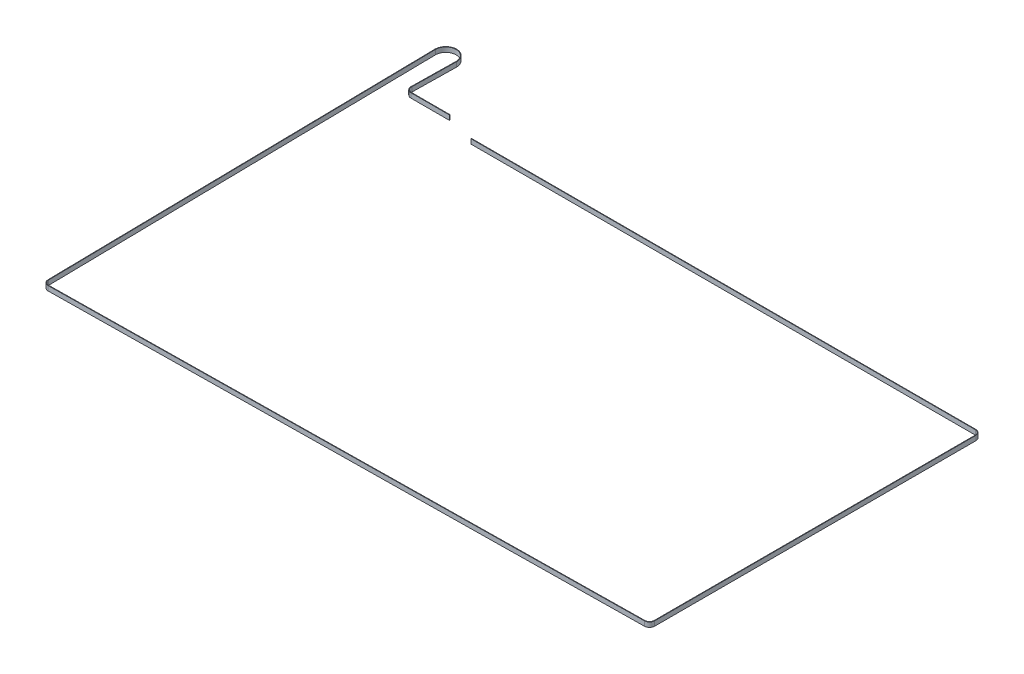
ISO-10303-21;
HEADER;
FILE_DESCRIPTION(('STEP AP214'),'2;1');
FILE_NAME('part.step','',(''),(''),'','','');
FILE_SCHEMA(('AUTOMOTIVE_DESIGN { 1 0 10303 214 1 1 1 1 }'));
ENDSEC;
DATA;
#1=APPLICATION_CONTEXT('core data for automotive mechanical design processes');
#2=APPLICATION_PROTOCOL_DEFINITION('international standard','automotive_design',2000,#1);
#3=PRODUCT_CONTEXT('',#1,'mechanical');
#4=PRODUCT('Part','Part','',(#3));
#5=PRODUCT_RELATED_PRODUCT_CATEGORY('part','',(#4));
#6=PRODUCT_DEFINITION_FORMATION('','',#4);
#7=PRODUCT_DEFINITION_CONTEXT('part definition',#1,'design');
#8=PRODUCT_DEFINITION('design','',#6,#7);
#9=PRODUCT_DEFINITION_SHAPE('','',#8);
#10=(LENGTH_UNIT() NAMED_UNIT(*) SI_UNIT(.MILLI.,.METRE.));
#11=(NAMED_UNIT(*) PLANE_ANGLE_UNIT() SI_UNIT($,.RADIAN.));
#12=(NAMED_UNIT(*) SI_UNIT($,.STERADIAN.) SOLID_ANGLE_UNIT());
#13=UNCERTAINTY_MEASURE_WITH_UNIT(LENGTH_MEASURE(1.E-05),#10,'distance_accuracy_value','');
#14=(GEOMETRIC_REPRESENTATION_CONTEXT(3) GLOBAL_UNCERTAINTY_ASSIGNED_CONTEXT((#13)) GLOBAL_UNIT_ASSIGNED_CONTEXT((#10,
#11,#12)) REPRESENTATION_CONTEXT('',''));
#15=CARTESIAN_POINT('',(0.,0.,0.));
#16=DIRECTION('',(0.,0.,1.));
#17=DIRECTION('',(1.,0.,0.));
#18=AXIS2_PLACEMENT_3D('',#15,#16,#17);
#19=CARTESIAN_POINT('',(107.943827046519,0.,89.0868906889753));
#20=DIRECTION('',(-0.999999924430759,0.,0.00038876532332332));
#21=DIRECTION('',(0.000388765323323324,0.,0.999999924430759));
#22=AXIS2_PLACEMENT_3D('',#19,#20,#21);
#23=PLANE('',#22);
#24=DIRECTION('',(0.,-1.,0.));
#25=VECTOR('',#24,1.);
#26=CARTESIAN_POINT('',(107.938449134375,9.5,75.2535793960742));
#27=LINE('',#26,#25);
#28=CARTESIAN_POINT('',(107.938449134375,15.5,75.2535793960742));
#29=VERTEX_POINT('',#28);
#30=CARTESIAN_POINT('',(107.938449134375,9.5,75.2535793960742));
#31=VERTEX_POINT('',#30);
#32=EDGE_CURVE('E220',#29,#31,#27,.T.);
#33=ORIENTED_EDGE('',*,*,#32,.T.);
#34=DIRECTION('',(0.000388765323323324,0.,0.999999924430759));
#35=VECTOR('',#34,1.);
#36=CARTESIAN_POINT('',(107.938709607142,9.5,75.9235793454429));
#37=LINE('',#36,#35);
#38=CARTESIAN_POINT('',(107.938709607142,9.5,75.9235793454429));
#39=VERTEX_POINT('',#38);
#40=EDGE_CURVE('E219',#31,#39,#37,.T.);
#41=ORIENTED_EDGE('',*,*,#40,.T.);
#42=DIRECTION('',(0.,1.,0.));
#43=VECTOR('',#42,1.);
#44=CARTESIAN_POINT('',(107.938709607142,9.5,75.9235793454429));
#45=LINE('',#44,#43);
#46=CARTESIAN_POINT('',(107.938709607142,15.5,75.9235793454429));
#47=VERTEX_POINT('',#46);
#48=EDGE_CURVE('E194',#39,#47,#45,.T.);
#49=ORIENTED_EDGE('',*,*,#48,.T.);
#50=DIRECTION('',(-0.000388765323323324,0.,-0.999999924430759));
#51=VECTOR('',#50,1.);
#52=CARTESIAN_POINT('',(107.938709607142,15.5,75.9235793454429));
#53=LINE('',#52,#51);
#54=EDGE_CURVE('E231',#47,#29,#53,.T.);
#55=ORIENTED_EDGE('',*,*,#54,.T.);
#56=EDGE_LOOP('',(#33,#41,#49,#55));
#57=FACE_BOUND('',#56,.T.);
#58=ADVANCED_FACE('F39',(#57),#23,.T.);
#59=CARTESIAN_POINT('',(67.9385793707588,0.,76.5868917090327));
#60=DIRECTION('',(-1.,0.,0.));
#61=DIRECTION('',(0.,0.,1.));
#62=AXIS2_PLACEMENT_3D('',#59,#60,#61);
#63=PLANE('',#62);
#64=DIRECTION('',(0.,-1.,0.));
#65=VECTOR('',#64,1.);
#66=CARTESIAN_POINT('',(67.9385793707588,9.5,62.7535793707587));
#67=LINE('',#66,#65);
#68=CARTESIAN_POINT('',(67.9385793707588,15.5,62.7535793707587));
#69=VERTEX_POINT('',#68);
#70=CARTESIAN_POINT('',(67.9385793707588,9.5,62.7535793707587));
#71=VERTEX_POINT('',#70);
#72=EDGE_CURVE('E1397',#69,#71,#67,.T.);
#73=ORIENTED_EDGE('',*,*,#72,.F.);
#74=DIRECTION('',(0.,0.,-1.));
#75=VECTOR('',#74,1.);
#76=CARTESIAN_POINT('',(67.9385793707588,15.5,63.4235793707587));
#77=LINE('',#76,#75);
#78=CARTESIAN_POINT('',(67.9385793707588,15.5,63.4235793707587));
#79=VERTEX_POINT('',#78);
#80=EDGE_CURVE('E1401',#79,#69,#77,.T.);
#81=ORIENTED_EDGE('',*,*,#80,.F.);
#82=DIRECTION('',(0.,1.,0.));
#83=VECTOR('',#82,1.);
#84=CARTESIAN_POINT('',(67.9385793707588,9.5,63.4235793707587));
#85=LINE('',#84,#83);
#86=CARTESIAN_POINT('',(67.9385793707588,9.5,63.4235793707587));
#87=VERTEX_POINT('',#86);
#88=EDGE_CURVE('E1419',#87,#79,#85,.T.);
#89=ORIENTED_EDGE('',*,*,#88,.F.);
#90=DIRECTION('',(0.,0.,1.));
#91=VECTOR('',#90,1.);
#92=CARTESIAN_POINT('',(67.9385793707588,9.5,63.4235793707587));
#93=LINE('',#92,#91);
#94=EDGE_CURVE('E1405',#71,#87,#93,.T.);
#95=ORIENTED_EDGE('',*,*,#94,.F.);
#96=EDGE_LOOP('',(#73,#81,#89,#95));
#97=FACE_BOUND('',#96,.T.);
#98=ADVANCED_FACE('F280',(#97),#63,.F.);
#99=CARTESIAN_POINT('',(751.000130236383,9.5,75.6735793454429));
#100=DIRECTION('',(0.000388765323323291,0.,0.999999924430759));
#101=DIRECTION('',(0.999999924430759,0.,-0.000388765323323292));
#102=AXIS2_PLACEMENT_3D('',#99,#100,#101);
#103=PLANE('',#102);
#104=DIRECTION('',(-0.999999924430759,0.,0.000388765323323292));
#105=VECTOR('',#104,1.);
#106=CARTESIAN_POINT('',(751.000130236383,15.5,75.6735793454429));
#107=LINE('',#106,#105);
#108=CARTESIAN_POINT('',(751.000065118191,15.5,75.6735793570459));
#109=VERTEX_POINT('',#108);
#110=EDGE_CURVE('E382',#109,#47,#107,.T.);
#111=ORIENTED_EDGE('',*,*,#110,.T.);
#112=ORIENTED_EDGE('',*,*,#48,.F.);
#113=DIRECTION('',(-0.999999924430759,0.,0.000388765323323292));
#114=VECTOR('',#113,1.);
#115=CARTESIAN_POINT('',(751.000130236383,9.5,75.6735793454429));
#116=LINE('',#115,#114);
#117=CARTESIAN_POINT('',(751.000065118192,9.50000000000001,75.6735793570459));
#118=VERTEX_POINT('',#117);
#119=EDGE_CURVE('E181',#118,#39,#116,.T.);
#120=ORIENTED_EDGE('',*,*,#119,.F.);
#121=DIRECTION('',(0.,1.,0.));
#122=VECTOR('',#121,1.);
#123=CARTESIAN_POINT('',(751.,9.5,75.6735793707586));
#124=LINE('',#123,#122);
#125=EDGE_CURVE('E42',#118,#109,#124,.T.);
#126=ORIENTED_EDGE('',*,*,#125,.T.);
#127=EDGE_LOOP('',(#111,#112,#120,#126));
#128=FACE_BOUND('',#127,.T.);
#129=ADVANCED_FACE('F193',(#128),#103,.T.);
#130=CARTESIAN_POINT('',(751.000130236383,15.5,75.6735793454429));
#131=DIRECTION('',(0.,1.,0.));
#132=DIRECTION('',(0.,0.,1.));
#133=AXIS2_PLACEMENT_3D('',#130,#131,#132);
#134=PLANE('',#133);
#135=DIRECTION('',(-0.999999924430759,0.,0.000388765323323292));
#136=VECTOR('',#135,1.);
#137=CARTESIAN_POINT('',(750.999869763617,15.5,75.0035793960743));
#138=LINE('',#137,#136);
#139=CARTESIAN_POINT('',(750.999934881809,15.5,75.0035793855261));
#140=VERTEX_POINT('',#139);
#141=EDGE_CURVE('E227',#140,#29,#138,.T.);
#142=ORIENTED_EDGE('',*,*,#141,.T.);
#143=ORIENTED_EDGE('',*,*,#54,.F.);
#144=ORIENTED_EDGE('',*,*,#110,.F.);
#145=DIRECTION('',(0.,0.,-1.));
#146=VECTOR('',#145,1.);
#147=CARTESIAN_POINT('',(751.,15.5,75.6735793707586));
#148=LINE('',#147,#146);
#149=EDGE_CURVE('E239',#109,#140,#148,.T.);
#150=ORIENTED_EDGE('',*,*,#149,.T.);
#151=EDGE_LOOP('',(#142,#143,#144,#150));
#152=FACE_BOUND('',#151,.T.);
#153=ADVANCED_FACE('F275',(#152),#134,.T.);
#154=CARTESIAN_POINT('',(750.999869763617,9.5,75.0035793960743));
#155=DIRECTION('',(-0.000388765323323291,0.,-0.999999924430759));
#156=DIRECTION('',(-0.999999924430759,0.,0.000388765323323292));
#157=AXIS2_PLACEMENT_3D('',#154,#155,#156);
#158=PLANE('',#157);
#159=DIRECTION('',(-0.999999924430759,0.,0.000388765323323292));
#160=VECTOR('',#159,1.);
#161=CARTESIAN_POINT('',(750.999869763617,9.5,75.0035793960743));
#162=LINE('',#161,#160);
#163=CARTESIAN_POINT('',(750.999934881809,9.5,75.0035793844712));
#164=VERTEX_POINT('',#163);
#165=EDGE_CURVE('E183',#164,#31,#162,.T.);
#166=ORIENTED_EDGE('',*,*,#165,.T.);
#167=ORIENTED_EDGE('',*,*,#32,.F.);
#168=ORIENTED_EDGE('',*,*,#141,.F.);
#169=DIRECTION('',(0.,-1.,0.));
#170=VECTOR('',#169,1.);
#171=CARTESIAN_POINT('',(751.,9.5,75.0035793707586));
#172=LINE('',#171,#170);
#173=EDGE_CURVE('E255',#140,#164,#172,.T.);
#174=ORIENTED_EDGE('',*,*,#173,.T.);
#175=EDGE_LOOP('',(#166,#167,#168,#174));
#176=FACE_BOUND('',#175,.T.);
#177=ADVANCED_FACE('F265',(#176),#158,.T.);
#178=CARTESIAN_POINT('',(751.000130236383,9.5,75.6735793454429));
#179=DIRECTION('',(0.,-1.,0.));
#180=DIRECTION('',(0.,0.,-1.));
#181=AXIS2_PLACEMENT_3D('',#178,#179,#180);
#182=PLANE('',#181);
#183=ORIENTED_EDGE('',*,*,#40,.F.);
#184=ORIENTED_EDGE('',*,*,#165,.F.);
#185=DIRECTION('',(0.,0.,1.));
#186=VECTOR('',#185,1.);
#187=CARTESIAN_POINT('',(751.,9.5,75.6735793707586));
#188=LINE('',#187,#186);
#189=EDGE_CURVE('E177',#164,#118,#188,.T.);
#190=ORIENTED_EDGE('',*,*,#189,.T.);
#191=ORIENTED_EDGE('',*,*,#119,.T.);
#192=EDGE_LOOP('',(#183,#184,#190,#191));
#193=FACE_BOUND('',#192,.T.);
#194=ADVANCED_FACE('F180',(#193),#182,.T.);
#195=CARTESIAN_POINT('',(751.,12.5,491.15));
#196=DIRECTION('',(0.,1.,0.));
#197=DIRECTION('',(0.,0.,1.));
#198=AXIS2_PLACEMENT_3D('',#195,#196,#197);
#199=CYLINDRICAL_SURFACE('',#198,5.91500000000011);
#200=CARTESIAN_POINT('',(751.,15.5,491.15));
#201=DIRECTION('',(0.,1.,0.));
#202=DIRECTION('',(0.,0.,1.));
#203=AXIS2_PLACEMENT_3D('',#200,#201,#202);
#204=CIRCLE('',#203,5.91500000000011);
#205=CARTESIAN_POINT('',(750.997767845033,15.5,497.065016361298));
#206=VERTEX_POINT('',#205);
#207=CARTESIAN_POINT('',(756.915,15.5,491.15));
#208=VERTEX_POINT('',#207);
#209=EDGE_CURVE('E429',#206,#208,#204,.T.);
#210=ORIENTED_EDGE('',*,*,#209,.T.);
#211=DIRECTION('',(0.,1.,0.));
#212=VECTOR('',#211,1.);
#213=CARTESIAN_POINT('',(756.915,9.5,491.15));
#214=LINE('',#213,#212);
#215=CARTESIAN_POINT('',(756.915,9.5,491.15));
#216=VERTEX_POINT('',#215);
#217=EDGE_CURVE('E1064',#216,#208,#214,.T.);
#218=ORIENTED_EDGE('',*,*,#217,.F.);
#219=CARTESIAN_POINT('',(751.,9.5,491.15));
#220=DIRECTION('',(0.,1.,0.));
#221=DIRECTION('',(0.,0.,1.));
#222=AXIS2_PLACEMENT_3D('',#219,#220,#221);
#223=CIRCLE('',#222,5.91500000000011);
#224=CARTESIAN_POINT('',(750.997767845033,9.5,497.065016361298));
#225=VERTEX_POINT('',#224);
#226=EDGE_CURVE('E225',#225,#216,#223,.T.);
#227=ORIENTED_EDGE('',*,*,#226,.F.);
#228=DIRECTION('',(0.,1.,0.));
#229=VECTOR('',#228,1.);
#230=CARTESIAN_POINT('',(750.995535664519,9.5,497.065029748024));
#231=LINE('',#230,#229);
#232=EDGE_CURVE('E730',#225,#206,#231,.T.);
#233=ORIENTED_EDGE('',*,*,#232,.T.);
#234=EDGE_LOOP('',(#210,#218,#227,#233));
#235=FACE_BOUND('',#234,.T.);
#236=ADVANCED_FACE('F279',(#235),#199,.F.);
#237=CARTESIAN_POINT('',(751.,15.5,497.065));
#238=DIRECTION('',(0.,1.,0.));
#239=DIRECTION('',(0.,0.,1.));
#240=AXIS2_PLACEMENT_3D('',#237,#238,#239);
#241=PLANE('',#240);
#242=CARTESIAN_POINT('',(751.,15.5,491.15));
#243=DIRECTION('',(0.,1.,0.));
#244=DIRECTION('',(0.,0.,1.));
#245=AXIS2_PLACEMENT_3D('',#242,#243,#244);
#246=CIRCLE('',#245,6.58500000000012);
#247=CARTESIAN_POINT('',(751.002232154967,15.5,497.734983638702));
#248=VERTEX_POINT('',#247);
#249=CARTESIAN_POINT('',(757.585,15.5,491.15));
#250=VERTEX_POINT('',#249);
#251=EDGE_CURVE('E317',#248,#250,#246,.T.);
#252=ORIENTED_EDGE('',*,*,#251,.T.);
#253=DIRECTION('',(1.,0.,0.));
#254=VECTOR('',#253,1.);
#255=CARTESIAN_POINT('',(756.915,15.5,491.15));
#256=LINE('',#255,#254);
#257=EDGE_CURVE('E310',#208,#250,#256,.T.);
#258=ORIENTED_EDGE('',*,*,#257,.F.);
#259=ORIENTED_EDGE('',*,*,#209,.F.);
#260=DIRECTION('',(0.0133263745700552,0.,0.999911199927683));
#261=VECTOR('',#260,1.);
#262=CARTESIAN_POINT('',(750.995535664519,15.5,497.065029748024));
#263=LINE('',#262,#261);
#264=EDGE_CURVE('E424',#206,#248,#263,.T.);
#265=ORIENTED_EDGE('',*,*,#264,.T.);
#266=EDGE_LOOP('',(#252,#258,#259,#265));
#267=FACE_BOUND('',#266,.T.);
#268=ADVANCED_FACE('F403',(#267),#241,.T.);
#269=CARTESIAN_POINT('',(751.,12.5,491.15));
#270=DIRECTION('',(0.,1.,0.));
#271=DIRECTION('',(0.,0.,1.));
#272=AXIS2_PLACEMENT_3D('',#269,#270,#271);
#273=CYLINDRICAL_SURFACE('',#272,6.58500000000012);
#274=CARTESIAN_POINT('',(751.,9.5,491.15));
#275=DIRECTION('',(0.,1.,0.));
#276=DIRECTION('',(0.,0.,1.));
#277=AXIS2_PLACEMENT_3D('',#274,#275,#276);
#278=CIRCLE('',#277,6.58500000000012);
#279=CARTESIAN_POINT('',(751.002232154967,9.5,497.734983638702));
#280=VERTEX_POINT('',#279);
#281=CARTESIAN_POINT('',(757.585,9.5,491.15));
#282=VERTEX_POINT('',#281);
#283=EDGE_CURVE('E316',#280,#282,#278,.T.);
#284=ORIENTED_EDGE('',*,*,#283,.T.);
#285=DIRECTION('',(0.,-1.,0.));
#286=VECTOR('',#285,1.);
#287=CARTESIAN_POINT('',(757.585,9.5,491.15));
#288=LINE('',#287,#286);
#289=EDGE_CURVE('E313',#250,#282,#288,.T.);
#290=ORIENTED_EDGE('',*,*,#289,.F.);
#291=ORIENTED_EDGE('',*,*,#251,.F.);
#292=DIRECTION('',(0.,-1.,0.));
#293=VECTOR('',#292,1.);
#294=CARTESIAN_POINT('',(751.004464335481,9.5,497.734970251976));
#295=LINE('',#294,#293);
#296=EDGE_CURVE('E509',#248,#280,#295,.T.);
#297=ORIENTED_EDGE('',*,*,#296,.T.);
#298=EDGE_LOOP('',(#284,#290,#291,#297));
#299=FACE_BOUND('',#298,.T.);
#300=ADVANCED_FACE('F347',(#299),#273,.T.);
#301=CARTESIAN_POINT('',(751.,9.5,497.065));
#302=DIRECTION('',(0.,-1.,0.));
#303=DIRECTION('',(0.,0.,-1.));
#304=AXIS2_PLACEMENT_3D('',#301,#302,#303);
#305=PLANE('',#304);
#306=DIRECTION('',(-1.,0.,0.));
#307=VECTOR('',#306,1.);
#308=CARTESIAN_POINT('',(756.915,9.5,491.15));
#309=LINE('',#308,#307);
#310=EDGE_CURVE('E321',#282,#216,#309,.T.);
#311=ORIENTED_EDGE('',*,*,#310,.F.);
#312=ORIENTED_EDGE('',*,*,#283,.F.);
#313=DIRECTION('',(-0.0133263745700552,0.,-0.999911199927683));
#314=VECTOR('',#313,1.);
#315=CARTESIAN_POINT('',(750.995535664519,9.5,497.065029748024));
#316=LINE('',#315,#314);
#317=EDGE_CURVE('E330',#280,#225,#316,.T.);
#318=ORIENTED_EDGE('',*,*,#317,.T.);
#319=ORIENTED_EDGE('',*,*,#226,.T.);
#320=EDGE_LOOP('',(#311,#312,#318,#319));
#321=FACE_BOUND('',#320,.T.);
#322=ADVANCED_FACE('F337',(#321),#305,.T.);
#323=CARTESIAN_POINT('',(756.915,9.5,491.15));
#324=DIRECTION('',(-1.,0.,0.));
#325=DIRECTION('',(0.,0.,1.));
#326=AXIS2_PLACEMENT_3D('',#323,#324,#325);
#327=PLANE('',#326);
#328=DIRECTION('',(0.,0.,-1.));
#329=VECTOR('',#328,1.);
#330=CARTESIAN_POINT('',(756.915,15.5,491.15));
#331=LINE('',#330,#329);
#332=CARTESIAN_POINT('',(756.915,15.5,81.5885793707588));
#333=VERTEX_POINT('',#332);
#334=EDGE_CURVE('E303',#208,#333,#331,.T.);
#335=ORIENTED_EDGE('',*,*,#334,.T.);
#336=DIRECTION('',(0.,1.,0.));
#337=VECTOR('',#336,1.);
#338=CARTESIAN_POINT('',(756.915,9.5,81.5885793707587));
#339=LINE('',#338,#337);
#340=CARTESIAN_POINT('',(756.915,9.5,81.5885793707588));
#341=VERTEX_POINT('',#340);
#342=EDGE_CURVE('E307',#341,#333,#339,.T.);
#343=ORIENTED_EDGE('',*,*,#342,.F.);
#344=DIRECTION('',(0.,0.,-1.));
#345=VECTOR('',#344,1.);
#346=CARTESIAN_POINT('',(756.915,9.5,491.15));
#347=LINE('',#346,#345);
#348=EDGE_CURVE('E323',#216,#341,#347,.T.);
#349=ORIENTED_EDGE('',*,*,#348,.F.);
#350=ORIENTED_EDGE('',*,*,#217,.T.);
#351=EDGE_LOOP('',(#335,#343,#349,#350));
#352=FACE_BOUND('',#351,.T.);
#353=ADVANCED_FACE('F346',(#352),#327,.T.);
#354=CARTESIAN_POINT('',(756.915,15.5,491.15));
#355=DIRECTION('',(0.,1.,0.));
#356=DIRECTION('',(0.,0.,1.));
#357=AXIS2_PLACEMENT_3D('',#354,#355,#356);
#358=PLANE('',#357);
#359=DIRECTION('',(0.,0.,-1.));
#360=VECTOR('',#359,1.);
#361=CARTESIAN_POINT('',(757.585,15.5,491.15));
#362=LINE('',#361,#360);
#363=CARTESIAN_POINT('',(757.585,15.5,81.5885793707588));
#364=VERTEX_POINT('',#363);
#365=EDGE_CURVE('E302',#250,#364,#362,.T.);
#366=ORIENTED_EDGE('',*,*,#365,.T.);
#367=DIRECTION('',(1.,0.,0.));
#368=VECTOR('',#367,1.);
#369=CARTESIAN_POINT('',(756.915,15.5,81.5885793707587));
#370=LINE('',#369,#368);
#371=EDGE_CURVE('E298',#333,#364,#370,.T.);
#372=ORIENTED_EDGE('',*,*,#371,.F.);
#373=ORIENTED_EDGE('',*,*,#334,.F.);
#374=ORIENTED_EDGE('',*,*,#257,.T.);
#375=EDGE_LOOP('',(#366,#372,#373,#374));
#376=FACE_BOUND('',#375,.T.);
#377=ADVANCED_FACE('F399',(#376),#358,.T.);
#378=CARTESIAN_POINT('',(757.585,9.5,491.15));
#379=DIRECTION('',(1.,0.,0.));
#380=DIRECTION('',(0.,0.,-1.));
#381=AXIS2_PLACEMENT_3D('',#378,#379,#380);
#382=PLANE('',#381);
#383=DIRECTION('',(0.,0.,-1.));
#384=VECTOR('',#383,1.);
#385=CARTESIAN_POINT('',(757.585,9.5,491.15));
#386=LINE('',#385,#384);
#387=CARTESIAN_POINT('',(757.585,9.5,81.5885793707588));
#388=VERTEX_POINT('',#387);
#389=EDGE_CURVE('E211',#282,#388,#386,.T.);
#390=ORIENTED_EDGE('',*,*,#389,.T.);
#391=DIRECTION('',(0.,-1.,0.));
#392=VECTOR('',#391,1.);
#393=CARTESIAN_POINT('',(757.585,9.5,81.5885793707587));
#394=LINE('',#393,#392);
#395=EDGE_CURVE('E305',#364,#388,#394,.T.);
#396=ORIENTED_EDGE('',*,*,#395,.F.);
#397=ORIENTED_EDGE('',*,*,#365,.F.);
#398=ORIENTED_EDGE('',*,*,#289,.T.);
#399=EDGE_LOOP('',(#390,#396,#397,#398));
#400=FACE_BOUND('',#399,.T.);
#401=ADVANCED_FACE('F353',(#400),#382,.T.);
#402=CARTESIAN_POINT('',(756.915,9.5,491.15));
#403=DIRECTION('',(0.,-1.,0.));
#404=DIRECTION('',(0.,0.,-1.));
#405=AXIS2_PLACEMENT_3D('',#402,#403,#404);
#406=PLANE('',#405);
#407=DIRECTION('',(-1.,0.,0.));
#408=VECTOR('',#407,1.);
#409=CARTESIAN_POINT('',(756.915,9.5,81.5885793707587));
#410=LINE('',#409,#408);
#411=EDGE_CURVE('E208',#388,#341,#410,.T.);
#412=ORIENTED_EDGE('',*,*,#411,.F.);
#413=ORIENTED_EDGE('',*,*,#389,.F.);
#414=ORIENTED_EDGE('',*,*,#310,.T.);
#415=ORIENTED_EDGE('',*,*,#348,.T.);
#416=EDGE_LOOP('',(#412,#413,#414,#415));
#417=FACE_BOUND('',#416,.T.);
#418=ADVANCED_FACE('F350',(#417),#406,.T.);
#419=CARTESIAN_POINT('',(751.,12.5,81.5885793707587));
#420=DIRECTION('',(0.,1.,0.));
#421=DIRECTION('',(0.,0.,1.));
#422=AXIS2_PLACEMENT_3D('',#419,#420,#421);
#423=CYLINDRICAL_SURFACE('',#422,5.91500000000011);
#424=CARTESIAN_POINT('',(751.,15.5,81.5885793707587));
#425=DIRECTION('',(0.,1.,0.));
#426=DIRECTION('',(1.,0.,0.));
#427=AXIS2_PLACEMENT_3D('',#424,#425,#426);
#428=CIRCLE('',#427,5.91500000000011);
#429=EDGE_CURVE('E203',#333,#109,#428,.T.);
#430=ORIENTED_EDGE('',*,*,#429,.T.);
#431=ORIENTED_EDGE('',*,*,#125,.F.);
#432=CARTESIAN_POINT('',(751.,9.5,81.5885793707587));
#433=DIRECTION('',(0.,1.,0.));
#434=DIRECTION('',(1.,0.,0.));
#435=AXIS2_PLACEMENT_3D('',#432,#433,#434);
#436=CIRCLE('',#435,5.91500000000011);
#437=EDGE_CURVE('E201',#341,#118,#436,.T.);
#438=ORIENTED_EDGE('',*,*,#437,.F.);
#439=ORIENTED_EDGE('',*,*,#342,.T.);
#440=EDGE_LOOP('',(#430,#431,#438,#439));
#441=FACE_BOUND('',#440,.T.);
#442=ADVANCED_FACE('F199',(#441),#423,.F.);
#443=CARTESIAN_POINT('',(756.915,15.5,81.5885793707588));
#444=DIRECTION('',(0.,1.,0.));
#445=DIRECTION('',(0.,0.,1.));
#446=AXIS2_PLACEMENT_3D('',#443,#444,#445);
#447=PLANE('',#446);
#448=CARTESIAN_POINT('',(751.,15.5,81.5885793707587));
#449=DIRECTION('',(0.,1.,0.));
#450=DIRECTION('',(1.,0.,0.));
#451=AXIS2_PLACEMENT_3D('',#448,#449,#450);
#452=CIRCLE('',#451,6.58500000000017);
#453=EDGE_CURVE('E242',#364,#140,#452,.T.);
#454=ORIENTED_EDGE('',*,*,#453,.T.);
#455=ORIENTED_EDGE('',*,*,#149,.F.);
#456=ORIENTED_EDGE('',*,*,#429,.F.);
#457=ORIENTED_EDGE('',*,*,#371,.T.);
#458=EDGE_LOOP('',(#454,#455,#456,#457));
#459=FACE_BOUND('',#458,.T.);
#460=ADVANCED_FACE('F295',(#459),#447,.T.);
#461=CARTESIAN_POINT('',(751.,12.5,81.5885793707587));
#462=DIRECTION('',(0.,1.,0.));
#463=DIRECTION('',(0.,0.,1.));
#464=AXIS2_PLACEMENT_3D('',#461,#462,#463);
#465=CYLINDRICAL_SURFACE('',#464,6.58500000000017);
#466=CARTESIAN_POINT('',(751.,9.5,81.5885793707587));
#467=DIRECTION('',(0.,1.,0.));
#468=DIRECTION('',(1.,0.,0.));
#469=AXIS2_PLACEMENT_3D('',#466,#467,#468);
#470=CIRCLE('',#469,6.58500000000017);
#471=EDGE_CURVE('E189',#388,#164,#470,.T.);
#472=ORIENTED_EDGE('',*,*,#471,.T.);
#473=ORIENTED_EDGE('',*,*,#173,.F.);
#474=ORIENTED_EDGE('',*,*,#453,.F.);
#475=ORIENTED_EDGE('',*,*,#395,.T.);
#476=EDGE_LOOP('',(#472,#473,#474,#475));
#477=FACE_BOUND('',#476,.T.);
#478=ADVANCED_FACE('F289',(#477),#465,.T.);
#479=CARTESIAN_POINT('',(756.915,9.5,81.5885793707588));
#480=DIRECTION('',(0.,-1.,0.));
#481=DIRECTION('',(0.,0.,-1.));
#482=AXIS2_PLACEMENT_3D('',#479,#480,#481);
#483=PLANE('',#482);
#484=ORIENTED_EDGE('',*,*,#189,.F.);
#485=ORIENTED_EDGE('',*,*,#471,.F.);
#486=ORIENTED_EDGE('',*,*,#411,.T.);
#487=ORIENTED_EDGE('',*,*,#437,.T.);
#488=EDGE_LOOP('',(#484,#485,#486,#487));
#489=FACE_BOUND('',#488,.T.);
#490=ADVANCED_FACE('F206',(#489),#483,.T.);
#491=CARTESIAN_POINT('',(0.6705356645189,9.5,507.065029748024));
#492=DIRECTION('',(-0.0133263745700552,0.,-0.999911199927683));
#493=DIRECTION('',(-0.999911199927683,0.,0.0133263745700552));
#494=AXIS2_PLACEMENT_3D('',#491,#492,#493);
#495=PLANE('',#494);
#496=DIRECTION('',(0.999911199927683,0.,-0.0133263745700552));
#497=VECTOR('',#496,1.);
#498=CARTESIAN_POINT('',(0.6705356645189,15.5,507.065029748024));
#499=LINE('',#498,#497);
#500=CARTESIAN_POINT('',(0.672767846024318,15.5,507.065016113406));
#501=VERTEX_POINT('',#500);
#502=EDGE_CURVE('E472',#501,#206,#499,.T.);
#503=ORIENTED_EDGE('',*,*,#502,.T.);
#504=ORIENTED_EDGE('',*,*,#232,.F.);
#505=DIRECTION('',(0.999911199927683,0.,-0.0133263745700552));
#506=VECTOR('',#505,1.);
#507=CARTESIAN_POINT('',(0.6705356645189,9.5,507.065029748024));
#508=LINE('',#507,#506);
#509=CARTESIAN_POINT('',(0.672767846024318,9.5,507.065016113406));
#510=VERTEX_POINT('',#509);
#511=EDGE_CURVE('E188',#510,#225,#508,.T.);
#512=ORIENTED_EDGE('',*,*,#511,.F.);
#513=DIRECTION('',(0.,1.,0.));
#514=VECTOR('',#513,1.);
#515=CARTESIAN_POINT('',(0.674999999999867,9.5,507.065));
#516=LINE('',#515,#514);
#517=EDGE_CURVE('E554',#510,#501,#516,.T.);
#518=ORIENTED_EDGE('',*,*,#517,.T.);
#519=EDGE_LOOP('',(#503,#504,#512,#518));
#520=FACE_BOUND('',#519,.T.);
#521=ADVANCED_FACE('F357',(#520),#495,.T.);
#522=CARTESIAN_POINT('',(0.6705356645189,15.5,507.065029748024));
#523=DIRECTION('',(0.,1.,0.));
#524=DIRECTION('',(0.,0.,1.));
#525=AXIS2_PLACEMENT_3D('',#522,#523,#524);
#526=PLANE('',#525);
#527=DIRECTION('',(0.999911199927683,0.,-0.0133263745700552));
#528=VECTOR('',#527,1.);
#529=CARTESIAN_POINT('',(0.679464335480837,15.5,507.734970251976));
#530=LINE('',#529,#528);
#531=CARTESIAN_POINT('',(0.677232145716659,15.5,507.734982647182));
#532=VERTEX_POINT('',#531);
#533=EDGE_CURVE('E471',#532,#248,#530,.T.);
#534=ORIENTED_EDGE('',*,*,#533,.T.);
#535=ORIENTED_EDGE('',*,*,#264,.F.);
#536=ORIENTED_EDGE('',*,*,#502,.F.);
#537=DIRECTION('',(0.,0.,1.));
#538=VECTOR('',#537,1.);
#539=CARTESIAN_POINT('',(0.674999999999867,15.5,507.065));
#540=LINE('',#539,#538);
#541=EDGE_CURVE('E517',#501,#532,#540,.T.);
#542=ORIENTED_EDGE('',*,*,#541,.T.);
#543=EDGE_LOOP('',(#534,#535,#536,#542));
#544=FACE_BOUND('',#543,.T.);
#545=ADVANCED_FACE('F491',(#544),#526,.T.);
#546=CARTESIAN_POINT('',(0.679464335480837,9.5,507.734970251976));
#547=DIRECTION('',(0.0133263745700552,0.,0.999911199927683));
#548=DIRECTION('',(0.999911199927683,0.,-0.0133263745700552));
#549=AXIS2_PLACEMENT_3D('',#546,#547,#548);
#550=PLANE('',#549);
#551=DIRECTION('',(0.999911199927683,0.,-0.0133263745700552));
#552=VECTOR('',#551,1.);
#553=CARTESIAN_POINT('',(0.679464335480837,9.5,507.734970251976));
#554=LINE('',#553,#552);
#555=CARTESIAN_POINT('',(0.677232153975417,9.5,507.734983886594));
#556=VERTEX_POINT('',#555);
#557=EDGE_CURVE('E732',#556,#280,#554,.T.);
#558=ORIENTED_EDGE('',*,*,#557,.T.);
#559=ORIENTED_EDGE('',*,*,#296,.F.);
#560=ORIENTED_EDGE('',*,*,#533,.F.);
#561=DIRECTION('',(0.,-1.,0.));
#562=VECTOR('',#561,1.);
#563=CARTESIAN_POINT('',(0.674999999999867,9.5,507.735));
#564=LINE('',#563,#562);
#565=EDGE_CURVE('E666',#532,#556,#564,.T.);
#566=ORIENTED_EDGE('',*,*,#565,.T.);
#567=EDGE_LOOP('',(#558,#559,#560,#566));
#568=FACE_BOUND('',#567,.T.);
#569=ADVANCED_FACE('F482',(#568),#550,.T.);
#570=CARTESIAN_POINT('',(0.6705356645189,9.5,507.065029748024));
#571=DIRECTION('',(0.,-1.,0.));
#572=DIRECTION('',(0.,0.,-1.));
#573=AXIS2_PLACEMENT_3D('',#570,#571,#572);
#574=PLANE('',#573);
#575=ORIENTED_EDGE('',*,*,#317,.F.);
#576=ORIENTED_EDGE('',*,*,#557,.F.);
#577=DIRECTION('',(0.,0.,-1.));
#578=VECTOR('',#577,1.);
#579=CARTESIAN_POINT('',(0.674999999999867,9.5,507.065));
#580=LINE('',#579,#578);
#581=EDGE_CURVE('E698',#556,#510,#580,.T.);
#582=ORIENTED_EDGE('',*,*,#581,.T.);
#583=ORIENTED_EDGE('',*,*,#511,.T.);
#584=EDGE_LOOP('',(#575,#576,#582,#583));
#585=FACE_BOUND('',#584,.T.);
#586=ADVANCED_FACE('F456',(#585),#574,.T.);
#587=CARTESIAN_POINT('',(0.675000000000017,12.5,501.15));
#588=DIRECTION('',(0.,1.,0.));
#589=DIRECTION('',(0.,0.,1.));
#590=AXIS2_PLACEMENT_3D('',#587,#588,#589);
#591=CYLINDRICAL_SURFACE('',#590,5.91500000000001);
#592=CARTESIAN_POINT('',(0.675000000000017,15.5,501.15));
#593=DIRECTION('',(0.,1.,0.));
#594=DIRECTION('',(-1.,0.,0.));
#595=AXIS2_PLACEMENT_3D('',#592,#593,#594);
#596=CIRCLE('',#595,5.91500000000001);
#597=CARTESIAN_POINT('',(-5.24002303322807,15.5,501.147351569666));
#598=VERTEX_POINT('',#597);
#599=EDGE_CURVE('E547',#598,#501,#596,.T.);
#600=ORIENTED_EDGE('',*,*,#599,.T.);
#601=ORIENTED_EDGE('',*,*,#517,.F.);
#602=CARTESIAN_POINT('',(0.675000000000017,9.5,501.15));
#603=DIRECTION('',(0.,1.,0.));
#604=DIRECTION('',(-1.,0.,0.));
#605=AXIS2_PLACEMENT_3D('',#602,#603,#604);
#606=CIRCLE('',#605,5.91500000000001);
#607=CARTESIAN_POINT('',(-5.24002303322807,9.5,501.147351569666));
#608=VERTEX_POINT('',#607);
#609=EDGE_CURVE('E734',#608,#510,#606,.T.);
#610=ORIENTED_EDGE('',*,*,#609,.F.);
#611=DIRECTION('',(0.,1.,0.));
#612=VECTOR('',#611,1.);
#613=CARTESIAN_POINT('',(-5.2400418790132,9.5,501.14470309666));
#614=LINE('',#613,#612);
#615=EDGE_CURVE('E1016',#608,#598,#614,.T.);
#616=ORIENTED_EDGE('',*,*,#615,.T.);
#617=EDGE_LOOP('',(#600,#601,#610,#616));
#618=FACE_BOUND('',#617,.T.);
#619=ADVANCED_FACE('F535',(#618),#591,.F.);
#620=CARTESIAN_POINT('',(-5.24,15.5,501.15));
#621=DIRECTION('',(0.,1.,0.));
#622=DIRECTION('',(0.,0.,1.));
#623=AXIS2_PLACEMENT_3D('',#620,#621,#622);
#624=PLANE('',#623);
#625=CARTESIAN_POINT('',(0.675000000000017,15.5,501.15));
#626=DIRECTION('',(0.,1.,0.));
#627=DIRECTION('',(-1.,0.,0.));
#628=AXIS2_PLACEMENT_3D('',#625,#626,#627);
#629=CIRCLE('',#628,6.58500000000001);
#630=CARTESIAN_POINT('',(-5.90997696677192,15.5,501.152648430334));
#631=VERTEX_POINT('',#630);
#632=EDGE_CURVE('E669',#631,#532,#629,.T.);
#633=ORIENTED_EDGE('',*,*,#632,.T.);
#634=ORIENTED_EDGE('',*,*,#541,.F.);
#635=ORIENTED_EDGE('',*,*,#599,.F.);
#636=DIRECTION('',(-0.999874988020296,0.,0.0158116517610712));
#637=VECTOR('',#636,1.);
#638=CARTESIAN_POINT('',(-5.2400418790132,15.5,501.14470309666));
#639=LINE('',#638,#637);
#640=EDGE_CURVE('E562',#598,#631,#639,.T.);
#641=ORIENTED_EDGE('',*,*,#640,.T.);
#642=EDGE_LOOP('',(#633,#634,#635,#641));
#643=FACE_BOUND('',#642,.T.);
#644=ADVANCED_FACE('F524',(#643),#624,.T.);
#645=CARTESIAN_POINT('',(0.675000000000017,12.5,501.15));
#646=DIRECTION('',(0.,1.,0.));
#647=DIRECTION('',(0.,0.,1.));
#648=AXIS2_PLACEMENT_3D('',#645,#646,#647);
#649=CYLINDRICAL_SURFACE('',#648,6.58500000000001);
#650=CARTESIAN_POINT('',(0.675000000000017,9.5,501.15));
#651=DIRECTION('',(0.,1.,0.));
#652=DIRECTION('',(-1.,0.,0.));
#653=AXIS2_PLACEMENT_3D('',#650,#651,#652);
#654=CIRCLE('',#653,6.58500000000001);
#655=CARTESIAN_POINT('',(-5.90997696677192,9.5,501.152648430334));
#656=VERTEX_POINT('',#655);
#657=EDGE_CURVE('E637',#656,#556,#654,.T.);
#658=ORIENTED_EDGE('',*,*,#657,.T.);
#659=ORIENTED_EDGE('',*,*,#565,.F.);
#660=ORIENTED_EDGE('',*,*,#632,.F.);
#661=DIRECTION('',(0.,-1.,0.));
#662=VECTOR('',#661,1.);
#663=CARTESIAN_POINT('',(-5.9099581209868,9.5,501.15529690334));
#664=LINE('',#663,#662);
#665=EDGE_CURVE('E568',#631,#656,#664,.T.);
#666=ORIENTED_EDGE('',*,*,#665,.T.);
#667=EDGE_LOOP('',(#658,#659,#660,#666));
#668=FACE_BOUND('',#667,.T.);
#669=ADVANCED_FACE('F534',(#668),#649,.T.);
#670=CARTESIAN_POINT('',(-5.24,9.5,501.15));
#671=DIRECTION('',(0.,-1.,0.));
#672=DIRECTION('',(0.,0.,-1.));
#673=AXIS2_PLACEMENT_3D('',#670,#671,#672);
#674=PLANE('',#673);
#675=ORIENTED_EDGE('',*,*,#581,.F.);
#676=ORIENTED_EDGE('',*,*,#657,.F.);
#677=DIRECTION('',(0.999874988020296,0.,-0.0158116517610712));
#678=VECTOR('',#677,1.);
#679=CARTESIAN_POINT('',(-5.2400418790132,9.5,501.14470309666));
#680=LINE('',#679,#678);
#681=EDGE_CURVE('E632',#656,#608,#680,.T.);
#682=ORIENTED_EDGE('',*,*,#681,.T.);
#683=ORIENTED_EDGE('',*,*,#609,.T.);
#684=EDGE_LOOP('',(#675,#676,#682,#683));
#685=FACE_BOUND('',#684,.T.);
#686=ADVANCED_FACE('F639',(#685),#674,.T.);
#687=CARTESIAN_POINT('',(-13.1650418790132,9.5,-0.00529690333995885));
#688=DIRECTION('',(0.999874988020296,0.,-0.0158116517610712));
#689=DIRECTION('',(-0.0158116517610712,0.,-0.999874988020296));
#690=AXIS2_PLACEMENT_3D('',#687,#688,#689);
#691=PLANE('',#690);
#692=DIRECTION('',(0.0158116517610712,0.,0.999874988020296));
#693=VECTOR('',#692,1.);
#694=CARTESIAN_POINT('',(-13.1650418790132,15.5,-0.00529690333995885));
#695=LINE('',#694,#693);
#696=CARTESIAN_POINT('',(-13.1650226842534,15.5,-0.00264842867800448));
#697=VERTEX_POINT('',#696);
#698=EDGE_CURVE('E1059',#697,#598,#695,.T.);
#699=ORIENTED_EDGE('',*,*,#698,.T.);
#700=ORIENTED_EDGE('',*,*,#615,.F.);
#701=DIRECTION('',(0.0158116517610712,0.,0.999874988020296));
#702=VECTOR('',#701,1.);
#703=CARTESIAN_POINT('',(-13.1650418790132,9.5,-0.00529690333995885));
#704=LINE('',#703,#702);
#705=CARTESIAN_POINT('',(-13.1650226842534,9.5,-0.00264842867800499));
#706=VERTEX_POINT('',#705);
#707=EDGE_CURVE('E1055',#706,#608,#704,.T.);
#708=ORIENTED_EDGE('',*,*,#707,.F.);
#709=DIRECTION('',(0.,1.,0.));
#710=VECTOR('',#709,1.);
#711=CARTESIAN_POINT('',(-13.165,9.5,0.));
#712=LINE('',#711,#710);
#713=EDGE_CURVE('E621',#706,#697,#712,.T.);
#714=ORIENTED_EDGE('',*,*,#713,.T.);
#715=EDGE_LOOP('',(#699,#700,#708,#714));
#716=FACE_BOUND('',#715,.T.);
#717=ADVANCED_FACE('F582',(#716),#691,.T.);
#718=CARTESIAN_POINT('',(-13.1650418790132,15.5,-0.00529690333995885));
#719=DIRECTION('',(0.,1.,0.));
#720=DIRECTION('',(0.,0.,1.));
#721=AXIS2_PLACEMENT_3D('',#718,#719,#720);
#722=PLANE('',#721);
#723=DIRECTION('',(0.0158116517610712,0.,0.999874988020296));
#724=VECTOR('',#723,1.);
#725=CARTESIAN_POINT('',(-13.8349581209868,15.5,0.00529690333995885));
#726=LINE('',#725,#724);
#727=CARTESIAN_POINT('',(-13.8349755709634,15.5,0.00264841488329652));
#728=VERTEX_POINT('',#727);
#729=EDGE_CURVE('E1080',#728,#631,#726,.T.);
#730=ORIENTED_EDGE('',*,*,#729,.T.);
#731=ORIENTED_EDGE('',*,*,#640,.F.);
#732=ORIENTED_EDGE('',*,*,#698,.F.);
#733=DIRECTION('',(-1.,0.,0.));
#734=VECTOR('',#733,1.);
#735=CARTESIAN_POINT('',(-13.165,15.5,0.));
#736=LINE('',#735,#734);
#737=EDGE_CURVE('E940',#697,#728,#736,.T.);
#738=ORIENTED_EDGE('',*,*,#737,.T.);
#739=EDGE_LOOP('',(#730,#731,#732,#738));
#740=FACE_BOUND('',#739,.T.);
#741=ADVANCED_FACE('F571',(#740),#722,.T.);
#742=CARTESIAN_POINT('',(-13.8349581209868,9.5,0.00529690333995885));
#743=DIRECTION('',(-0.999874988020296,0.,0.0158116517610712));
#744=DIRECTION('',(0.0158116517610712,0.,0.999874988020296));
#745=AXIS2_PLACEMENT_3D('',#742,#743,#744);
#746=PLANE('',#745);
#747=DIRECTION('',(0.0158116517610712,0.,0.999874988020296));
#748=VECTOR('',#747,1.);
#749=CARTESIAN_POINT('',(-13.8349581209868,9.5,0.00529690333995885));
#750=LINE('',#749,#748);
#751=CARTESIAN_POINT('',(-13.8349773157466,9.5,0.00264842867800242));
#752=VERTEX_POINT('',#751);
#753=EDGE_CURVE('E1006',#752,#656,#750,.T.);
#754=ORIENTED_EDGE('',*,*,#753,.T.);
#755=ORIENTED_EDGE('',*,*,#665,.F.);
#756=ORIENTED_EDGE('',*,*,#729,.F.);
#757=DIRECTION('',(0.,-1.,0.));
#758=VECTOR('',#757,1.);
#759=CARTESIAN_POINT('',(-13.835,9.5,0.));
#760=LINE('',#759,#758);
#761=EDGE_CURVE('E593',#728,#752,#760,.T.);
#762=ORIENTED_EDGE('',*,*,#761,.T.);
#763=EDGE_LOOP('',(#754,#755,#756,#762));
#764=FACE_BOUND('',#763,.T.);
#765=ADVANCED_FACE('F581',(#764),#746,.T.);
#766=CARTESIAN_POINT('',(-13.1650418790132,9.5,-0.00529690333995885));
#767=DIRECTION('',(0.,-1.,0.));
#768=DIRECTION('',(0.,0.,-1.));
#769=AXIS2_PLACEMENT_3D('',#766,#767,#768);
#770=PLANE('',#769);
#771=ORIENTED_EDGE('',*,*,#681,.F.);
#772=ORIENTED_EDGE('',*,*,#753,.F.);
#773=DIRECTION('',(1.,0.,0.));
#774=VECTOR('',#773,1.);
#775=CARTESIAN_POINT('',(-13.165,9.5,0.));
#776=LINE('',#775,#774);
#777=EDGE_CURVE('E613',#752,#706,#776,.T.);
#778=ORIENTED_EDGE('',*,*,#777,.T.);
#779=ORIENTED_EDGE('',*,*,#707,.T.);
#780=EDGE_LOOP('',(#771,#772,#778,#779));
#781=FACE_BOUND('',#780,.T.);
#782=ADVANCED_FACE('F1034',(#781),#770,.T.);
#783=CARTESIAN_POINT('',(12.2777572780365,9.5,56.2148573801935));
#784=DIRECTION('',(-0.999875008388919,0.,-0.0158103636662311));
#785=DIRECTION('',(-0.0158103636662311,0.,0.99987500838892));
#786=AXIS2_PLACEMENT_3D('',#783,#784,#785);
#787=PLANE('',#786);
#788=DIRECTION('',(0.0158103636662311,0.,-0.999875008388919));
#789=VECTOR('',#788,1.);
#790=CARTESIAN_POINT('',(12.2777572780365,15.5,56.2148573801935));
#791=LINE('',#790,#789);
#792=CARTESIAN_POINT('',(12.2782281040354,15.5,56.2034616744691));
#793=VERTEX_POINT('',#792);
#794=CARTESIAN_POINT('',(13.1633544854401,15.5,0.208143437665925));
#795=VERTEX_POINT('',#794);
#796=EDGE_CURVE('E839',#793,#795,#791,.T.);
#797=ORIENTED_EDGE('',*,*,#796,.T.);
#798=DIRECTION('',(0.,1.,0.));
#799=VECTOR('',#798,1.);
#800=CARTESIAN_POINT('',(13.1633544854401,9.5,0.208143437665923));
#801=LINE('',#800,#799);
#802=CARTESIAN_POINT('',(13.1633544854401,9.5,0.208143437665925));
#803=VERTEX_POINT('',#802);
#804=EDGE_CURVE('E848',#803,#795,#801,.T.);
#805=ORIENTED_EDGE('',*,*,#804,.F.);
#806=DIRECTION('',(0.0158103636662311,0.,-0.999875008388919));
#807=VECTOR('',#806,1.);
#808=CARTESIAN_POINT('',(12.2777572780365,9.5,56.2148573801935));
#809=LINE('',#808,#807);
#810=CARTESIAN_POINT('',(12.2782886252594,9.5,56.2034650310033));
#811=VERTEX_POINT('',#810);
#812=EDGE_CURVE('E1002',#811,#803,#809,.T.);
#813=ORIENTED_EDGE('',*,*,#812,.F.);
#814=DIRECTION('',(0.,1.,0.));
#815=VECTOR('',#814,1.);
#816=CARTESIAN_POINT('',(12.278596945014,9.5,56.1958669392754));
#817=LINE('',#816,#815);
#818=EDGE_CURVE('E805',#811,#793,#817,.T.);
#819=ORIENTED_EDGE('',*,*,#818,.T.);
#820=EDGE_LOOP('',(#797,#805,#813,#819));
#821=FACE_BOUND('',#820,.T.);
#822=ADVANCED_FACE('F771',(#821),#787,.T.);
#823=CARTESIAN_POINT('',(12.2777572780365,15.5,56.2148573801935));
#824=DIRECTION('',(0.,1.,0.));
#825=DIRECTION('',(0.,0.,1.));
#826=AXIS2_PLACEMENT_3D('',#823,#824,#825);
#827=PLANE('',#826);
#828=DIRECTION('',(0.0158103636662311,0.,-0.999875008388919));
#829=VECTOR('',#828,1.);
#830=CARTESIAN_POINT('',(12.947673533657,15.5,56.2254503238499));
#831=LINE('',#830,#829);
#832=CARTESIAN_POINT('',(12.947231245872,15.5,56.2349449769258));
#833=VERTEX_POINT('',#832);
#834=CARTESIAN_POINT('',(13.8332707410607,15.5,0.218736381322297));
#835=VERTEX_POINT('',#834);
#836=EDGE_CURVE('E901',#833,#835,#831,.T.);
#837=ORIENTED_EDGE('',*,*,#836,.T.);
#838=DIRECTION('',(0.999875008388919,0.,0.0158103636662311));
#839=VECTOR('',#838,1.);
#840=CARTESIAN_POINT('',(13.1633544854401,15.5,0.208143437665923));
#841=LINE('',#840,#839);
#842=EDGE_CURVE('E847',#795,#835,#841,.T.);
#843=ORIENTED_EDGE('',*,*,#842,.F.);
#844=ORIENTED_EDGE('',*,*,#796,.F.);
#845=DIRECTION('',(0.997368539799302,0.,0.0724982470036875));
#846=VECTOR('',#845,1.);
#847=CARTESIAN_POINT('',(12.278596945014,15.5,56.1958669392754));
#848=LINE('',#847,#846);
#849=EDGE_CURVE('E851',#793,#833,#848,.T.);
#850=ORIENTED_EDGE('',*,*,#849,.T.);
#851=EDGE_LOOP('',(#837,#843,#844,#850));
#852=FACE_BOUND('',#851,.T.);
#853=ADVANCED_FACE('F914',(#852),#827,.T.);
#854=CARTESIAN_POINT('',(12.947673533657,9.5,56.2254503238499));
#855=DIRECTION('',(0.999875008388919,0.,0.0158103636662311));
#856=DIRECTION('',(0.0158103636662311,0.,-0.99987500838892));
#857=AXIS2_PLACEMENT_3D('',#854,#855,#856);
#858=PLANE('',#857);
#859=DIRECTION('',(0.0158103636662311,0.,-0.999875008388919));
#860=VECTOR('',#859,1.);
#861=CARTESIAN_POINT('',(12.947673533657,9.5,56.2254503238499));
#862=LINE('',#861,#860);
#863=CARTESIAN_POINT('',(12.9471437256454,9.5,56.2368427515296));
#864=VERTEX_POINT('',#863);
#865=CARTESIAN_POINT('',(13.8332707410607,9.5,0.218736381322297));
#866=VERTEX_POINT('',#865);
#867=EDGE_CURVE('E780',#864,#866,#862,.T.);
#868=ORIENTED_EDGE('',*,*,#867,.T.);
#869=DIRECTION('',(0.,-1.,0.));
#870=VECTOR('',#869,1.);
#871=CARTESIAN_POINT('',(13.8332707410607,9.5,0.218736381322298));
#872=LINE('',#871,#870);
#873=EDGE_CURVE('E788',#835,#866,#872,.T.);
#874=ORIENTED_EDGE('',*,*,#873,.F.);
#875=ORIENTED_EDGE('',*,*,#836,.F.);
#876=DIRECTION('',(0.,-1.,0.));
#877=VECTOR('',#876,1.);
#878=CARTESIAN_POINT('',(12.9468338666795,9.5,56.2444407647679));
#879=LINE('',#878,#877);
#880=EDGE_CURVE('E58',#833,#864,#879,.T.);
#881=ORIENTED_EDGE('',*,*,#880,.T.);
#882=EDGE_LOOP('',(#868,#874,#875,#881));
#883=FACE_BOUND('',#882,.T.);
#884=ADVANCED_FACE('F903',(#883),#858,.T.);
#885=CARTESIAN_POINT('',(12.2777572780365,9.5,56.2148573801935));
#886=DIRECTION('',(0.,-1.,0.));
#887=DIRECTION('',(0.,0.,-1.));
#888=AXIS2_PLACEMENT_3D('',#885,#886,#887);
#889=PLANE('',#888);
#890=DIRECTION('',(-0.999875008388919,0.,-0.0158103636662311));
#891=VECTOR('',#890,1.);
#892=CARTESIAN_POINT('',(13.1633544854401,9.5,0.208143437665923));
#893=LINE('',#892,#891);
#894=EDGE_CURVE('E787',#866,#803,#893,.T.);
#895=ORIENTED_EDGE('',*,*,#894,.F.);
#896=ORIENTED_EDGE('',*,*,#867,.F.);
#897=DIRECTION('',(-0.997368539799302,0.,-0.0724982470036875));
#898=VECTOR('',#897,1.);
#899=CARTESIAN_POINT('',(12.278596945014,9.5,56.1958669392754));
#900=LINE('',#899,#898);
#901=EDGE_CURVE('E11',#864,#811,#900,.T.);
#902=ORIENTED_EDGE('',*,*,#901,.T.);
#903=ORIENTED_EDGE('',*,*,#812,.T.);
#904=EDGE_LOOP('',(#895,#896,#902,#903));
#905=FACE_BOUND('',#904,.T.);
#906=ADVANCED_FACE('F913',(#905),#889,.T.);
#907=CARTESIAN_POINT('',(0.,12.5,0.));
#908=DIRECTION('',(0.,1.,0.));
#909=DIRECTION('',(0.,0.,1.));
#910=AXIS2_PLACEMENT_3D('',#907,#908,#909);
#911=CYLINDRICAL_SURFACE('',#910,13.165);
#912=CARTESIAN_POINT('',(0.,15.5,0.));
#913=DIRECTION('',(0.,1.,0.));
#914=DIRECTION('',(0.999875008388919,0.,0.0158103636662307));
#915=AXIS2_PLACEMENT_3D('',#912,#913,#914);
#916=CIRCLE('',#915,13.165);
#917=EDGE_CURVE('E624',#795,#697,#916,.T.);
#918=ORIENTED_EDGE('',*,*,#917,.T.);
#919=ORIENTED_EDGE('',*,*,#713,.F.);
#920=CARTESIAN_POINT('',(0.,9.5,0.));
#921=DIRECTION('',(0.,1.,0.));
#922=DIRECTION('',(0.999875008388919,0.,0.0158103636662307));
#923=AXIS2_PLACEMENT_3D('',#920,#921,#922);
#924=CIRCLE('',#923,13.165);
#925=EDGE_CURVE('E618',#803,#706,#924,.T.);
#926=ORIENTED_EDGE('',*,*,#925,.F.);
#927=ORIENTED_EDGE('',*,*,#804,.T.);
#928=EDGE_LOOP('',(#918,#919,#926,#927));
#929=FACE_BOUND('',#928,.T.);
#930=ADVANCED_FACE('F954',(#929),#911,.F.);
#931=CARTESIAN_POINT('',(13.1633544854401,15.5,0.208143437665926));
#932=DIRECTION('',(0.,1.,0.));
#933=DIRECTION('',(0.,0.,1.));
#934=AXIS2_PLACEMENT_3D('',#931,#932,#933);
#935=PLANE('',#934);
#936=CARTESIAN_POINT('',(0.,15.5,0.));
#937=DIRECTION('',(0.,1.,0.));
#938=DIRECTION('',(0.999875008388919,0.,0.0158103636662307));
#939=AXIS2_PLACEMENT_3D('',#936,#937,#938);
#940=CIRCLE('',#939,13.835);
#941=EDGE_CURVE('E602',#835,#728,#940,.T.);
#942=ORIENTED_EDGE('',*,*,#941,.T.);
#943=ORIENTED_EDGE('',*,*,#737,.F.);
#944=ORIENTED_EDGE('',*,*,#917,.F.);
#945=ORIENTED_EDGE('',*,*,#842,.T.);
#946=EDGE_LOOP('',(#942,#943,#944,#945));
#947=FACE_BOUND('',#946,.T.);
#948=ADVANCED_FACE('F915',(#947),#935,.T.);
#949=CARTESIAN_POINT('',(0.,12.5,0.));
#950=DIRECTION('',(0.,1.,0.));
#951=DIRECTION('',(0.,0.,1.));
#952=AXIS2_PLACEMENT_3D('',#949,#950,#951);
#953=CYLINDRICAL_SURFACE('',#952,13.835);
#954=CARTESIAN_POINT('',(0.,9.5,0.));
#955=DIRECTION('',(0.,1.,0.));
#956=DIRECTION('',(0.999875008388919,0.,0.0158103636662307));
#957=AXIS2_PLACEMENT_3D('',#954,#955,#956);
#958=CIRCLE('',#957,13.835);
#959=EDGE_CURVE('E601',#866,#752,#958,.T.);
#960=ORIENTED_EDGE('',*,*,#959,.T.);
#961=ORIENTED_EDGE('',*,*,#761,.F.);
#962=ORIENTED_EDGE('',*,*,#941,.F.);
#963=ORIENTED_EDGE('',*,*,#873,.T.);
#964=EDGE_LOOP('',(#960,#961,#962,#963));
#965=FACE_BOUND('',#964,.T.);
#966=ADVANCED_FACE('F918',(#965),#953,.T.);
#967=CARTESIAN_POINT('',(13.1633544854401,9.5,0.208143437665926));
#968=DIRECTION('',(0.,-1.,0.));
#969=DIRECTION('',(0.,0.,-1.));
#970=AXIS2_PLACEMENT_3D('',#967,#968,#969);
#971=PLANE('',#970);
#972=ORIENTED_EDGE('',*,*,#777,.F.);
#973=ORIENTED_EDGE('',*,*,#959,.F.);
#974=ORIENTED_EDGE('',*,*,#894,.T.);
#975=ORIENTED_EDGE('',*,*,#925,.T.);
#976=EDGE_LOOP('',(#972,#973,#974,#975));
#977=FACE_BOUND('',#976,.T.);
#978=ADVANCED_FACE('F922',(#977),#971,.T.);
#979=CARTESIAN_POINT('',(67.9385793707588,9.5,63.4235793707587));
#980=DIRECTION('',(0.,0.,1.));
#981=DIRECTION('',(1.,0.,0.));
#982=AXIS2_PLACEMENT_3D('',#979,#980,#981);
#983=PLANE('',#982);
#984=DIRECTION('',(-1.,0.,0.));
#985=VECTOR('',#984,1.);
#986=CARTESIAN_POINT('',(67.9385793707588,15.5,63.4235793707587));
#987=LINE('',#986,#985);
#988=CARTESIAN_POINT('',(19.,15.5,63.4235793707587));
#989=VERTEX_POINT('',#988);
#990=EDGE_CURVE('E1418',#79,#989,#987,.T.);
#991=ORIENTED_EDGE('',*,*,#990,.T.);
#992=DIRECTION('',(0.,1.,0.));
#993=VECTOR('',#992,1.);
#994=CARTESIAN_POINT('',(19.,9.5,63.4235793707587));
#995=LINE('',#994,#993);
#996=CARTESIAN_POINT('',(19.,9.5,63.4235793707587));
#997=VERTEX_POINT('',#996);
#998=EDGE_CURVE('E1440',#997,#989,#995,.T.);
#999=ORIENTED_EDGE('',*,*,#998,.F.);
#1000=DIRECTION('',(-1.,0.,0.));
#1001=VECTOR('',#1000,1.);
#1002=CARTESIAN_POINT('',(67.9385793707588,9.5,63.4235793707587));
#1003=LINE('',#1002,#1001);
#1004=EDGE_CURVE('E1431',#87,#997,#1003,.T.);
#1005=ORIENTED_EDGE('',*,*,#1004,.F.);
#1006=ORIENTED_EDGE('',*,*,#88,.T.);
#1007=EDGE_LOOP('',(#991,#999,#1005,#1006));
#1008=FACE_BOUND('',#1007,.T.);
#1009=ADVANCED_FACE('F822',(#1008),#983,.T.);
#1010=CARTESIAN_POINT('',(67.9385793707588,15.5,63.4235793707587));
#1011=DIRECTION('',(0.,1.,0.));
#1012=DIRECTION('',(0.,0.,1.));
#1013=AXIS2_PLACEMENT_3D('',#1010,#1011,#1012);
#1014=PLANE('',#1013);
#1015=DIRECTION('',(-1.,0.,0.));
#1016=VECTOR('',#1015,1.);
#1017=CARTESIAN_POINT('',(67.9385793707588,15.5,62.7535793707587));
#1018=LINE('',#1017,#1016);
#1019=CARTESIAN_POINT('',(19.,15.5,62.7535793707587));
#1020=VERTEX_POINT('',#1019);
#1021=EDGE_CURVE('E1415',#69,#1020,#1018,.T.);
#1022=ORIENTED_EDGE('',*,*,#1021,.T.);
#1023=DIRECTION('',(0.,0.,-1.));
#1024=VECTOR('',#1023,1.);
#1025=CARTESIAN_POINT('',(19.,15.5,63.4235793707587));
#1026=LINE('',#1025,#1024);
#1027=EDGE_CURVE('E1424',#989,#1020,#1026,.T.);
#1028=ORIENTED_EDGE('',*,*,#1027,.F.);
#1029=ORIENTED_EDGE('',*,*,#990,.F.);
#1030=ORIENTED_EDGE('',*,*,#80,.T.);
#1031=EDGE_LOOP('',(#1022,#1028,#1029,#1030));
#1032=FACE_BOUND('',#1031,.T.);
#1033=ADVANCED_FACE('F823',(#1032),#1014,.T.);
#1034=CARTESIAN_POINT('',(67.9385793707588,9.5,62.7535793707587));
#1035=DIRECTION('',(0.,0.,-1.));
#1036=DIRECTION('',(-1.,0.,0.));
#1037=AXIS2_PLACEMENT_3D('',#1034,#1035,#1036);
#1038=PLANE('',#1037);
#1039=DIRECTION('',(-1.,0.,0.));
#1040=VECTOR('',#1039,1.);
#1041=CARTESIAN_POINT('',(67.9385793707588,9.5,62.7535793707587));
#1042=LINE('',#1041,#1040);
#1043=CARTESIAN_POINT('',(19.,9.5,62.7535793707587));
#1044=VERTEX_POINT('',#1043);
#1045=EDGE_CURVE('E1426',#71,#1044,#1042,.T.);
#1046=ORIENTED_EDGE('',*,*,#1045,.T.);
#1047=DIRECTION('',(0.,-1.,0.));
#1048=VECTOR('',#1047,1.);
#1049=CARTESIAN_POINT('',(19.,9.5,62.7535793707587));
#1050=LINE('',#1049,#1048);
#1051=EDGE_CURVE('E1423',#1020,#1044,#1050,.T.);
#1052=ORIENTED_EDGE('',*,*,#1051,.F.);
#1053=ORIENTED_EDGE('',*,*,#1021,.F.);
#1054=ORIENTED_EDGE('',*,*,#72,.T.);
#1055=EDGE_LOOP('',(#1046,#1052,#1053,#1054));
#1056=FACE_BOUND('',#1055,.T.);
#1057=ADVANCED_FACE('F826',(#1056),#1038,.T.);
#1058=CARTESIAN_POINT('',(67.9385793707588,9.5,63.4235793707587));
#1059=DIRECTION('',(0.,-1.,0.));
#1060=DIRECTION('',(0.,0.,-1.));
#1061=AXIS2_PLACEMENT_3D('',#1058,#1059,#1060);
#1062=PLANE('',#1061);
#1063=DIRECTION('',(0.,0.,1.));
#1064=VECTOR('',#1063,1.);
#1065=CARTESIAN_POINT('',(19.,9.5,63.4235793707587));
#1066=LINE('',#1065,#1064);
#1067=EDGE_CURVE('E860',#1044,#997,#1066,.T.);
#1068=ORIENTED_EDGE('',*,*,#1067,.F.);
#1069=ORIENTED_EDGE('',*,*,#1045,.F.);
#1070=ORIENTED_EDGE('',*,*,#94,.T.);
#1071=ORIENTED_EDGE('',*,*,#1004,.T.);
#1072=EDGE_LOOP('',(#1068,#1069,#1070,#1071));
#1073=FACE_BOUND('',#1072,.T.);
#1074=ADVANCED_FACE('F770',(#1073),#1062,.T.);
#1075=CARTESIAN_POINT('',(19.,12.5,56.6844425454298));
#1076=DIRECTION('',(0.,-1.,0.));
#1077=DIRECTION('',(0.,0.,-1.));
#1078=AXIS2_PLACEMENT_3D('',#1075,#1076,#1077);
#1079=CYLINDRICAL_SURFACE('',#1078,6.73913682532894);
#1080=CARTESIAN_POINT('',(19.,15.5,56.6844425454298));
#1081=DIRECTION('',(0.,-1.,0.));
#1082=DIRECTION('',(0.,0.,1.));
#1083=AXIS2_PLACEMENT_3D('',#1080,#1081,#1082);
#1084=CIRCLE('',#1083,6.73913682532894);
#1085=EDGE_CURVE('E850',#989,#793,#1084,.T.);
#1086=ORIENTED_EDGE('',*,*,#1085,.T.);
#1087=ORIENTED_EDGE('',*,*,#818,.F.);
#1088=CARTESIAN_POINT('',(19.,9.5,56.6844425454298));
#1089=DIRECTION('',(0.,-1.,0.));
#1090=DIRECTION('',(0.,0.,1.));
#1091=AXIS2_PLACEMENT_3D('',#1088,#1089,#1090);
#1092=CIRCLE('',#1091,6.73913682532894);
#1093=EDGE_CURVE('E855',#997,#811,#1092,.T.);
#1094=ORIENTED_EDGE('',*,*,#1093,.F.);
#1095=ORIENTED_EDGE('',*,*,#998,.T.);
#1096=EDGE_LOOP('',(#1086,#1087,#1094,#1095));
#1097=FACE_BOUND('',#1096,.T.);
#1098=ADVANCED_FACE('F812',(#1097),#1079,.T.);
#1099=CARTESIAN_POINT('',(19.,15.5,63.4235793707587));
#1100=DIRECTION('',(0.,1.,0.));
#1101=DIRECTION('',(0.,0.,1.));
#1102=AXIS2_PLACEMENT_3D('',#1099,#1100,#1101);
#1103=PLANE('',#1102);
#1104=CARTESIAN_POINT('',(19.,15.5,56.6844425454298));
#1105=DIRECTION('',(0.,-1.,0.));
#1106=DIRECTION('',(0.,0.,1.));
#1107=AXIS2_PLACEMENT_3D('',#1104,#1105,#1106);
#1108=CIRCLE('',#1107,6.06913682532895);
#1109=EDGE_CURVE('E797',#1020,#833,#1108,.T.);
#1110=ORIENTED_EDGE('',*,*,#1109,.T.);
#1111=ORIENTED_EDGE('',*,*,#849,.F.);
#1112=ORIENTED_EDGE('',*,*,#1085,.F.);
#1113=ORIENTED_EDGE('',*,*,#1027,.T.);
#1114=EDGE_LOOP('',(#1110,#1111,#1112,#1113));
#1115=FACE_BOUND('',#1114,.T.);
#1116=ADVANCED_FACE('F763',(#1115),#1103,.T.);
#1117=CARTESIAN_POINT('',(19.,12.5,56.6844425454298));
#1118=DIRECTION('',(0.,-1.,0.));
#1119=DIRECTION('',(0.,0.,-1.));
#1120=AXIS2_PLACEMENT_3D('',#1117,#1118,#1119);
#1121=CYLINDRICAL_SURFACE('',#1120,6.06913682532895);
#1122=CARTESIAN_POINT('',(19.,9.5,56.6844425454298));
#1123=DIRECTION('',(0.,-1.,0.));
#1124=DIRECTION('',(0.,0.,1.));
#1125=AXIS2_PLACEMENT_3D('',#1122,#1123,#1124);
#1126=CIRCLE('',#1125,6.06913682532895);
#1127=EDGE_CURVE('E49',#1044,#864,#1126,.T.);
#1128=ORIENTED_EDGE('',*,*,#1127,.T.);
#1129=ORIENTED_EDGE('',*,*,#880,.F.);
#1130=ORIENTED_EDGE('',*,*,#1109,.F.);
#1131=ORIENTED_EDGE('',*,*,#1051,.T.);
#1132=EDGE_LOOP('',(#1128,#1129,#1130,#1131));
#1133=FACE_BOUND('',#1132,.T.);
#1134=ADVANCED_FACE('F757',(#1133),#1121,.F.);
#1135=CARTESIAN_POINT('',(19.,9.5,63.4235793707587));
#1136=DIRECTION('',(0.,-1.,0.));
#1137=DIRECTION('',(0.,0.,-1.));
#1138=AXIS2_PLACEMENT_3D('',#1135,#1136,#1137);
#1139=PLANE('',#1138);
#1140=ORIENTED_EDGE('',*,*,#901,.F.);
#1141=ORIENTED_EDGE('',*,*,#1127,.F.);
#1142=ORIENTED_EDGE('',*,*,#1067,.T.);
#1143=ORIENTED_EDGE('',*,*,#1093,.T.);
#1144=EDGE_LOOP('',(#1140,#1141,#1142,#1143));
#1145=FACE_BOUND('',#1144,.T.);
#1146=ADVANCED_FACE('F755',(#1145),#1139,.T.);
#1147=CLOSED_SHELL('',(#58,#98,#129,#153,#177,#194,#236,#268,#300,#322,#353,#377,#401,#418,#442,
#460,#478,#490,#521,#545,#569,#586,#619,#644,#669,#686,#717,#741,#765,#782,#822,#853,#884,#906,
#930,#948,#966,#978,#1009,#1033,#1057,#1074,#1098,#1116,#1134,#1146));
#1148=MANIFOLD_SOLID_BREP('B2',#1147);
#1149=ADVANCED_BREP_SHAPE_REPRESENTATION('',(#18,#1148),#14);
#1150=SHAPE_DEFINITION_REPRESENTATION(#9,#1149);
ENDSEC;
END-ISO-10303-21;
